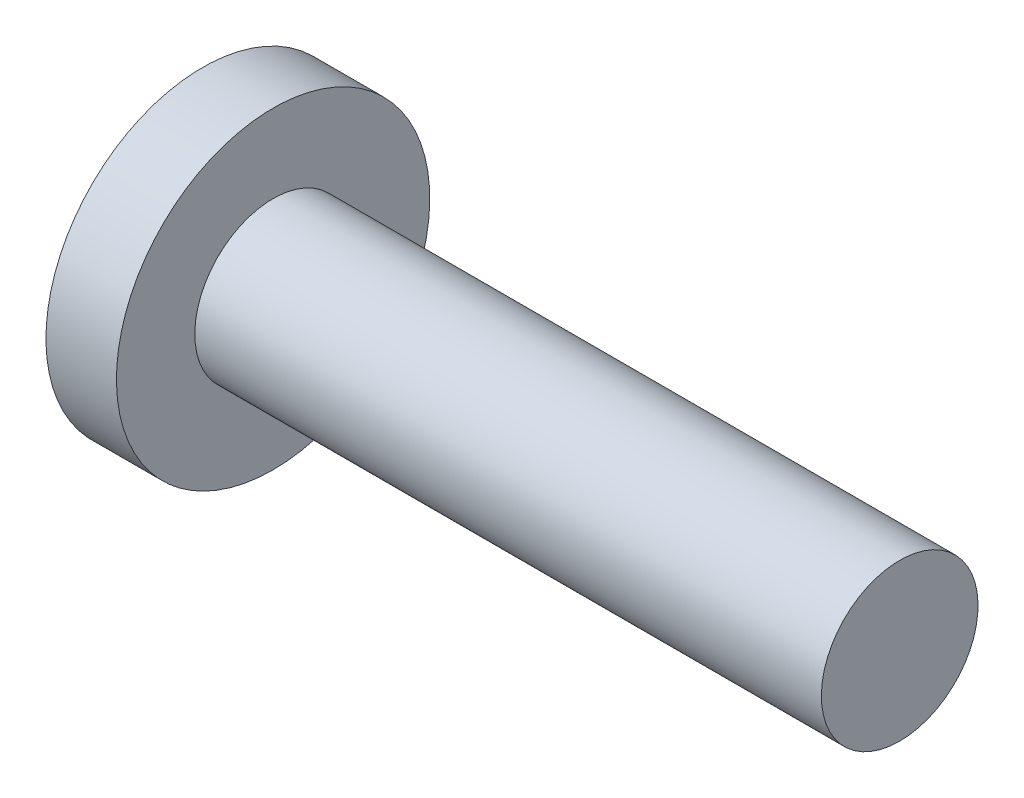
ISO-10303-21;
HEADER;
FILE_DESCRIPTION(('STEP AP214'),'2;1');
FILE_NAME('part.step','',(''),(''),'','','');
FILE_SCHEMA(('AUTOMOTIVE_DESIGN { 1 0 10303 214 1 1 1 1 }'));
ENDSEC;
DATA;
#1=APPLICATION_CONTEXT('core data for automotive mechanical design processes');
#2=APPLICATION_PROTOCOL_DEFINITION('international standard','automotive_design',2000,#1);
#3=PRODUCT_CONTEXT('',#1,'mechanical');
#4=PRODUCT('Part','Part','',(#3));
#5=PRODUCT_RELATED_PRODUCT_CATEGORY('part','',(#4));
#6=PRODUCT_DEFINITION_FORMATION('','',#4);
#7=PRODUCT_DEFINITION_CONTEXT('part definition',#1,'design');
#8=PRODUCT_DEFINITION('design','',#6,#7);
#9=PRODUCT_DEFINITION_SHAPE('','',#8);
#10=(LENGTH_UNIT() NAMED_UNIT(*) SI_UNIT(.MILLI.,.METRE.));
#11=(NAMED_UNIT(*) PLANE_ANGLE_UNIT() SI_UNIT($,.RADIAN.));
#12=(NAMED_UNIT(*) SI_UNIT($,.STERADIAN.) SOLID_ANGLE_UNIT());
#13=UNCERTAINTY_MEASURE_WITH_UNIT(LENGTH_MEASURE(1.E-05),#10,'distance_accuracy_value','');
#14=(GEOMETRIC_REPRESENTATION_CONTEXT(3) GLOBAL_UNCERTAINTY_ASSIGNED_CONTEXT((#13)) GLOBAL_UNIT_ASSIGNED_CONTEXT((#10,
#11,#12)) REPRESENTATION_CONTEXT('',''));
#15=CARTESIAN_POINT('',(0.,0.,0.));
#16=DIRECTION('',(0.,0.,1.));
#17=DIRECTION('',(1.,0.,0.));
#18=AXIS2_PLACEMENT_3D('',#15,#16,#17);
#19=CARTESIAN_POINT('',(0.,0.,0.));
#20=DIRECTION('',(-1.,0.,0.));
#21=DIRECTION('',(0.,-1.,0.));
#22=AXIS2_PLACEMENT_3D('',#19,#20,#21);
#23=PLANE('',#22);
#24=CARTESIAN_POINT('',(0.,-1.,0.));
#25=DIRECTION('',(-1.,0.,0.));
#26=DIRECTION('',(0.,-1.,0.));
#27=AXIS2_PLACEMENT_3D('',#24,#25,#26);
#28=CIRCLE('',#27,2.);
#29=CARTESIAN_POINT('',(0.,-3.,0.));
#30=VERTEX_POINT('',#29);
#31=EDGE_CURVE('E10',#30,#30,#28,.T.);
#32=ORIENTED_EDGE('',*,*,#31,.F.);
#33=EDGE_LOOP('',(#32));
#34=FACE_BOUND('',#33,.T.);
#35=CARTESIAN_POINT('',(0.,-1.,0.));
#36=DIRECTION('',(-1.,0.,0.));
#37=DIRECTION('',(0.,-1.,0.));
#38=AXIS2_PLACEMENT_3D('',#35,#36,#37);
#39=CIRCLE('',#38,1.);
#40=CARTESIAN_POINT('',(0.,-2.,0.));
#41=VERTEX_POINT('',#40);
#42=EDGE_CURVE('E47',#41,#41,#39,.T.);
#43=ORIENTED_EDGE('',*,*,#42,.T.);
#44=EDGE_LOOP('',(#43));
#45=FACE_BOUND('',#44,.T.);
#46=ADVANCED_FACE('F33',(#34,#45),#23,.F.);
#47=CARTESIAN_POINT('',(-0.9,-1.,0.));
#48=DIRECTION('',(-1.,0.,0.));
#49=DIRECTION('',(0.,-1.,0.));
#50=AXIS2_PLACEMENT_3D('',#47,#48,#49);
#51=CYLINDRICAL_SURFACE('',#50,2.);
#52=CARTESIAN_POINT('',(-0.9,-1.,0.));
#53=DIRECTION('',(-1.,0.,0.));
#54=DIRECTION('',(0.,-1.,0.));
#55=AXIS2_PLACEMENT_3D('',#52,#53,#54);
#56=CIRCLE('',#55,2.);
#57=CARTESIAN_POINT('',(-0.9,-3.,0.));
#58=VERTEX_POINT('',#57);
#59=EDGE_CURVE('E39',#58,#58,#56,.T.);
#60=ORIENTED_EDGE('',*,*,#59,.F.);
#61=EDGE_LOOP('',(#60));
#62=FACE_BOUND('',#61,.T.);
#63=ORIENTED_EDGE('',*,*,#31,.T.);
#64=EDGE_LOOP('',(#63));
#65=FACE_BOUND('',#64,.T.);
#66=ADVANCED_FACE('F67',(#62,#65),#51,.T.);
#67=CARTESIAN_POINT('',(-0.9,0.999999999999999,0.));
#68=DIRECTION('',(1.,0.,0.));
#69=DIRECTION('',(0.,1.,0.));
#70=AXIS2_PLACEMENT_3D('',#67,#68,#69);
#71=PLANE('',#70);
#72=ORIENTED_EDGE('',*,*,#59,.T.);
#73=EDGE_LOOP('',(#72));
#74=FACE_BOUND('',#73,.T.);
#75=ADVANCED_FACE('F62',(#74),#71,.F.);
#76=CARTESIAN_POINT('',(8.,0.,0.));
#77=DIRECTION('',(-1.,0.,0.));
#78=DIRECTION('',(0.,-1.,0.));
#79=AXIS2_PLACEMENT_3D('',#76,#77,#78);
#80=PLANE('',#79);
#81=CARTESIAN_POINT('',(8.,-1.,0.));
#82=DIRECTION('',(-1.,0.,0.));
#83=DIRECTION('',(0.,-1.,0.));
#84=AXIS2_PLACEMENT_3D('',#81,#82,#83);
#85=CIRCLE('',#84,1.);
#86=CARTESIAN_POINT('',(8.,-2.,0.));
#87=VERTEX_POINT('',#86);
#88=EDGE_CURVE('E43',#87,#87,#85,.T.);
#89=ORIENTED_EDGE('',*,*,#88,.F.);
#90=EDGE_LOOP('',(#89));
#91=FACE_BOUND('',#90,.T.);
#92=ADVANCED_FACE('F57',(#91),#80,.F.);
#93=CARTESIAN_POINT('',(-0.9,-1.,0.));
#94=DIRECTION('',(-1.,0.,0.));
#95=DIRECTION('',(0.,-1.,0.));
#96=AXIS2_PLACEMENT_3D('',#93,#94,#95);
#97=CYLINDRICAL_SURFACE('',#96,1.);
#98=ORIENTED_EDGE('',*,*,#42,.F.);
#99=EDGE_LOOP('',(#98));
#100=FACE_BOUND('',#99,.T.);
#101=ORIENTED_EDGE('',*,*,#88,.T.);
#102=EDGE_LOOP('',(#101));
#103=FACE_BOUND('',#102,.T.);
#104=ADVANCED_FACE('F54',(#100,#103),#97,.T.);
#105=CLOSED_SHELL('',(#46,#66,#75,#92,#104));
#106=MANIFOLD_SOLID_BREP('B2',#105);
#107=ADVANCED_BREP_SHAPE_REPRESENTATION('',(#18,#106),#14);
#108=SHAPE_DEFINITION_REPRESENTATION(#9,#107);
ENDSEC;
END-ISO-10303-21;
